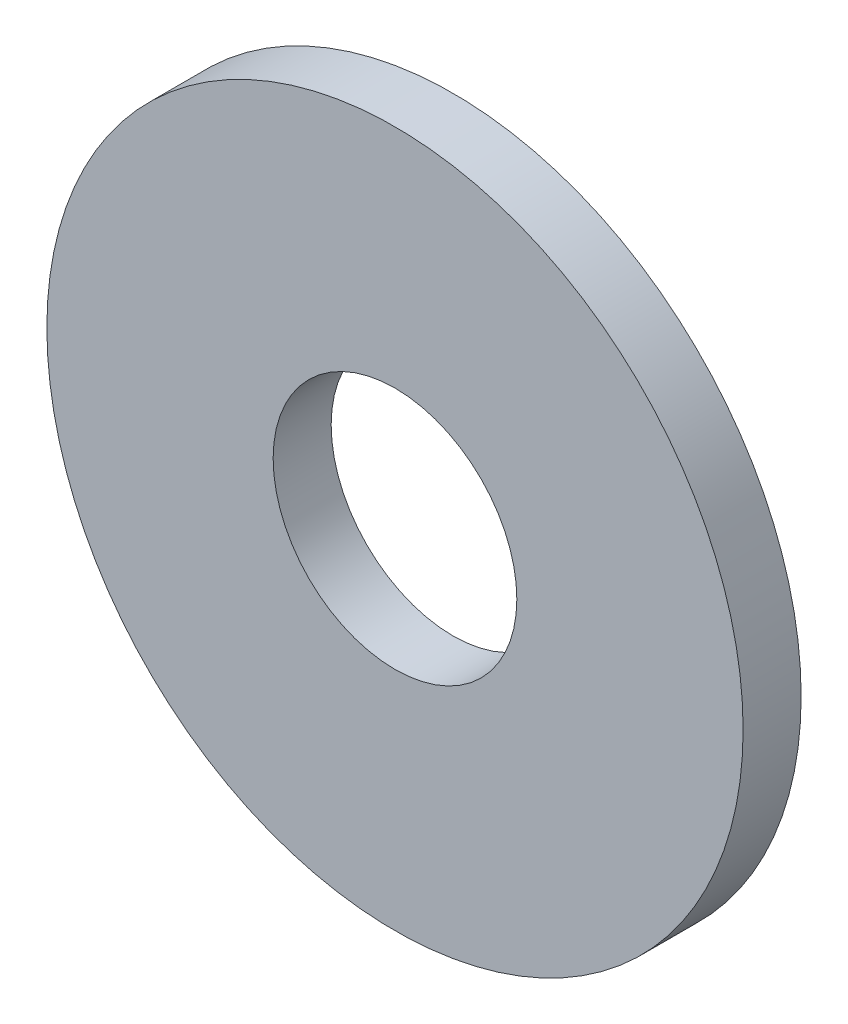
ISO-10303-21;
HEADER;
FILE_DESCRIPTION(('STEP AP214'),'2;1');
FILE_NAME('part.step','',(''),(''),'','','');
FILE_SCHEMA(('AUTOMOTIVE_DESIGN { 1 0 10303 214 1 1 1 1 }'));
ENDSEC;
DATA;
#1=APPLICATION_CONTEXT('core data for automotive mechanical design processes');
#2=APPLICATION_PROTOCOL_DEFINITION('international standard','automotive_design',2000,#1);
#3=PRODUCT_CONTEXT('',#1,'mechanical');
#4=PRODUCT('Part','Part','',(#3));
#5=PRODUCT_RELATED_PRODUCT_CATEGORY('part','',(#4));
#6=PRODUCT_DEFINITION_FORMATION('','',#4);
#7=PRODUCT_DEFINITION_CONTEXT('part definition',#1,'design');
#8=PRODUCT_DEFINITION('design','',#6,#7);
#9=PRODUCT_DEFINITION_SHAPE('','',#8);
#10=(LENGTH_UNIT() NAMED_UNIT(*) SI_UNIT(.MILLI.,.METRE.));
#11=(NAMED_UNIT(*) PLANE_ANGLE_UNIT() SI_UNIT($,.RADIAN.));
#12=(NAMED_UNIT(*) SI_UNIT($,.STERADIAN.) SOLID_ANGLE_UNIT());
#13=UNCERTAINTY_MEASURE_WITH_UNIT(LENGTH_MEASURE(1.E-05),#10,'distance_accuracy_value','');
#14=(GEOMETRIC_REPRESENTATION_CONTEXT(3) GLOBAL_UNCERTAINTY_ASSIGNED_CONTEXT((#13)) GLOBAL_UNIT_ASSIGNED_CONTEXT((#10,
#11,#12)) REPRESENTATION_CONTEXT('',''));
#15=CARTESIAN_POINT('',(0.,0.,0.));
#16=DIRECTION('',(0.,0.,1.));
#17=DIRECTION('',(1.,0.,0.));
#18=AXIS2_PLACEMENT_3D('',#15,#16,#17);
#19=CARTESIAN_POINT('',(0.,0.,1.));
#20=DIRECTION('',(0.,0.,1.));
#21=DIRECTION('',(1.,0.,0.));
#22=AXIS2_PLACEMENT_3D('',#19,#20,#21);
#23=PLANE('',#22);
#24=CARTESIAN_POINT('',(0.,0.,1.));
#25=DIRECTION('',(0.,0.,1.));
#26=DIRECTION('',(1.,0.,0.));
#27=AXIS2_PLACEMENT_3D('',#24,#25,#26);
#28=CIRCLE('',#27,12.);
#29=CARTESIAN_POINT('',(12.,0.,1.));
#30=VERTEX_POINT('',#29);
#31=EDGE_CURVE('E10',#30,#30,#28,.T.);
#32=ORIENTED_EDGE('',*,*,#31,.T.);
#33=EDGE_LOOP('',(#32));
#34=FACE_BOUND('',#33,.T.);
#35=CARTESIAN_POINT('',(0.,0.,1.));
#36=DIRECTION('',(0.,0.,1.));
#37=DIRECTION('',(1.,0.,0.));
#38=AXIS2_PLACEMENT_3D('',#35,#36,#37);
#39=CIRCLE('',#38,4.2);
#40=CARTESIAN_POINT('',(4.2,0.,1.));
#41=VERTEX_POINT('',#40);
#42=EDGE_CURVE('E46',#41,#41,#39,.T.);
#43=ORIENTED_EDGE('',*,*,#42,.F.);
#44=EDGE_LOOP('',(#43));
#45=FACE_BOUND('',#44,.T.);
#46=ADVANCED_FACE('F35',(#34,#45),#23,.T.);
#47=CARTESIAN_POINT('',(0.,0.,-1.));
#48=DIRECTION('',(0.,0.,1.));
#49=DIRECTION('',(1.,0.,0.));
#50=AXIS2_PLACEMENT_3D('',#47,#48,#49);
#51=PLANE('',#50);
#52=CARTESIAN_POINT('',(0.,0.,-1.));
#53=DIRECTION('',(0.,0.,1.));
#54=DIRECTION('',(1.,0.,0.));
#55=AXIS2_PLACEMENT_3D('',#52,#53,#54);
#56=CIRCLE('',#55,12.);
#57=CARTESIAN_POINT('',(12.,0.,-1.));
#58=VERTEX_POINT('',#57);
#59=EDGE_CURVE('E39',#58,#58,#56,.T.);
#60=ORIENTED_EDGE('',*,*,#59,.F.);
#61=EDGE_LOOP('',(#60));
#62=FACE_BOUND('',#61,.T.);
#63=CARTESIAN_POINT('',(0.,0.,-1.));
#64=DIRECTION('',(0.,0.,1.));
#65=DIRECTION('',(1.,0.,0.));
#66=AXIS2_PLACEMENT_3D('',#63,#64,#65);
#67=CIRCLE('',#66,4.2);
#68=CARTESIAN_POINT('',(4.2,0.,-1.));
#69=VERTEX_POINT('',#68);
#70=EDGE_CURVE('E48',#69,#69,#67,.T.);
#71=ORIENTED_EDGE('',*,*,#70,.T.);
#72=EDGE_LOOP('',(#71));
#73=FACE_BOUND('',#72,.T.);
#74=ADVANCED_FACE('F58',(#62,#73),#51,.F.);
#75=CARTESIAN_POINT('',(0.,0.,1.));
#76=DIRECTION('',(0.,0.,-1.));
#77=DIRECTION('',(-1.,0.,0.));
#78=AXIS2_PLACEMENT_3D('',#75,#76,#77);
#79=CYLINDRICAL_SURFACE('',#78,12.);
#80=ORIENTED_EDGE('',*,*,#31,.F.);
#81=EDGE_LOOP('',(#80));
#82=FACE_BOUND('',#81,.T.);
#83=ORIENTED_EDGE('',*,*,#59,.T.);
#84=EDGE_LOOP('',(#83));
#85=FACE_BOUND('',#84,.T.);
#86=ADVANCED_FACE('F37',(#82,#85),#79,.T.);
#87=CARTESIAN_POINT('',(0.,0.,1.));
#88=DIRECTION('',(0.,0.,-1.));
#89=DIRECTION('',(-1.,0.,0.));
#90=AXIS2_PLACEMENT_3D('',#87,#88,#89);
#91=CYLINDRICAL_SURFACE('',#90,4.2);
#92=ORIENTED_EDGE('',*,*,#42,.T.);
#93=EDGE_LOOP('',(#92));
#94=FACE_BOUND('',#93,.T.);
#95=ORIENTED_EDGE('',*,*,#70,.F.);
#96=EDGE_LOOP('',(#95));
#97=FACE_BOUND('',#96,.T.);
#98=ADVANCED_FACE('F54',(#94,#97),#91,.F.);
#99=CLOSED_SHELL('',(#46,#74,#86,#98));
#100=MANIFOLD_SOLID_BREP('B2',#99);
#101=ADVANCED_BREP_SHAPE_REPRESENTATION('',(#18,#100),#14);
#102=SHAPE_DEFINITION_REPRESENTATION(#9,#101);
ENDSEC;
END-ISO-10303-21;
